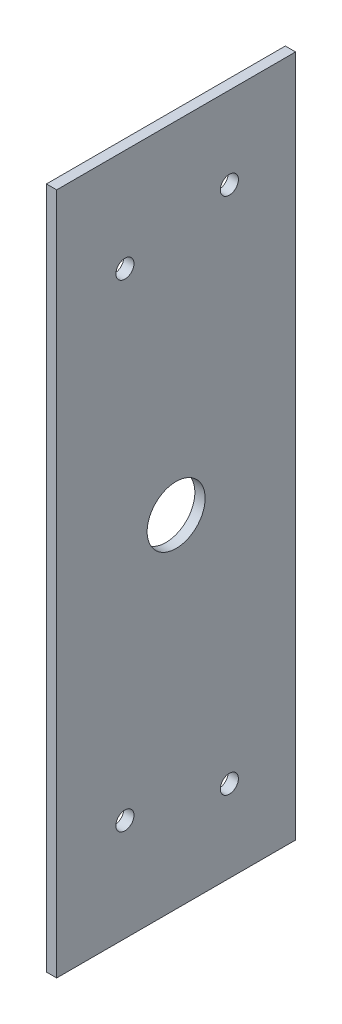
ISO-10303-21;
HEADER;
FILE_DESCRIPTION(('STEP AP214'),'2;1');
FILE_NAME('part.step','',(''),(''),'','','');
FILE_SCHEMA(('AUTOMOTIVE_DESIGN { 1 0 10303 214 1 1 1 1 }'));
ENDSEC;
DATA;
#1=APPLICATION_CONTEXT('core data for automotive mechanical design processes');
#2=APPLICATION_PROTOCOL_DEFINITION('international standard','automotive_design',2000,#1);
#3=PRODUCT_CONTEXT('',#1,'mechanical');
#4=PRODUCT('Part','Part','',(#3));
#5=PRODUCT_RELATED_PRODUCT_CATEGORY('part','',(#4));
#6=PRODUCT_DEFINITION_FORMATION('','',#4);
#7=PRODUCT_DEFINITION_CONTEXT('part definition',#1,'design');
#8=PRODUCT_DEFINITION('design','',#6,#7);
#9=PRODUCT_DEFINITION_SHAPE('','',#8);
#10=(LENGTH_UNIT() NAMED_UNIT(*) SI_UNIT(.MILLI.,.METRE.));
#11=(NAMED_UNIT(*) PLANE_ANGLE_UNIT() SI_UNIT($,.RADIAN.));
#12=(NAMED_UNIT(*) SI_UNIT($,.STERADIAN.) SOLID_ANGLE_UNIT());
#13=UNCERTAINTY_MEASURE_WITH_UNIT(LENGTH_MEASURE(1.E-05),#10,'distance_accuracy_value','');
#14=(GEOMETRIC_REPRESENTATION_CONTEXT(3) GLOBAL_UNCERTAINTY_ASSIGNED_CONTEXT((#13)) GLOBAL_UNIT_ASSIGNED_CONTEXT((#10,
#11,#12)) REPRESENTATION_CONTEXT('',''));
#15=CARTESIAN_POINT('',(0.,0.,0.));
#16=DIRECTION('',(0.,0.,1.));
#17=DIRECTION('',(1.,0.,0.));
#18=AXIS2_PLACEMENT_3D('',#15,#16,#17);
#19=CARTESIAN_POINT('',(3.,0.,0.));
#20=DIRECTION('',(1.,0.,0.));
#21=DIRECTION('',(0.,0.,-1.));
#22=AXIS2_PLACEMENT_3D('',#19,#20,#21);
#23=PLANE('',#22);
#24=CARTESIAN_POINT('',(3.,-70.,15.));
#25=DIRECTION('',(1.,0.,0.));
#26=DIRECTION('',(0.,0.,-1.));
#27=AXIS2_PLACEMENT_3D('',#24,#25,#26);
#28=CIRCLE('',#27,2.65);
#29=CARTESIAN_POINT('',(3.,-70.,12.35));
#30=VERTEX_POINT('',#29);
#31=EDGE_CURVE('E140',#30,#30,#28,.T.);
#32=ORIENTED_EDGE('',*,*,#31,.F.);
#33=EDGE_LOOP('',(#32));
#34=FACE_BOUND('',#33,.T.);
#35=CARTESIAN_POINT('',(3.,-76.,-15.6));
#36=DIRECTION('',(1.,0.,0.));
#37=DIRECTION('',(0.,0.,-1.));
#38=AXIS2_PLACEMENT_3D('',#35,#36,#37);
#39=CIRCLE('',#38,2.65);
#40=CARTESIAN_POINT('',(3.,-76.,-18.25));
#41=VERTEX_POINT('',#40);
#42=EDGE_CURVE('E124',#41,#41,#39,.T.);
#43=ORIENTED_EDGE('',*,*,#42,.F.);
#44=EDGE_LOOP('',(#43));
#45=FACE_BOUND('',#44,.T.);
#46=DIRECTION('',(0.,0.,-1.));
#47=VECTOR('',#46,1.);
#48=CARTESIAN_POINT('',(3.,-100.,35.));
#49=LINE('',#48,#47);
#50=CARTESIAN_POINT('',(3.,-100.,35.));
#51=VERTEX_POINT('',#50);
#52=CARTESIAN_POINT('',(3.,-100.,-35.));
#53=VERTEX_POINT('',#52);
#54=EDGE_CURVE('E92',#51,#53,#49,.T.);
#55=ORIENTED_EDGE('',*,*,#54,.T.);
#56=DIRECTION('',(0.,1.,0.));
#57=VECTOR('',#56,1.);
#58=CARTESIAN_POINT('',(3.,-100.,-35.));
#59=LINE('',#58,#57);
#60=CARTESIAN_POINT('',(3.,100.,-35.));
#61=VERTEX_POINT('',#60);
#62=EDGE_CURVE('E89',#53,#61,#59,.T.);
#63=ORIENTED_EDGE('',*,*,#62,.T.);
#64=DIRECTION('',(0.,0.,1.));
#65=VECTOR('',#64,1.);
#66=CARTESIAN_POINT('',(3.,100.,35.));
#67=LINE('',#66,#65);
#68=CARTESIAN_POINT('',(3.,100.,35.));
#69=VERTEX_POINT('',#68);
#70=EDGE_CURVE('E91',#61,#69,#67,.T.);
#71=ORIENTED_EDGE('',*,*,#70,.T.);
#72=DIRECTION('',(0.,-1.,0.));
#73=VECTOR('',#72,1.);
#74=CARTESIAN_POINT('',(3.,-100.,35.));
#75=LINE('',#74,#73);
#76=EDGE_CURVE('E58',#69,#51,#75,.T.);
#77=ORIENTED_EDGE('',*,*,#76,.T.);
#78=EDGE_LOOP('',(#55,#63,#71,#77));
#79=FACE_BOUND('',#78,.T.);
#80=CARTESIAN_POINT('',(3.,0.,0.));
#81=DIRECTION('',(1.,0.,0.));
#82=DIRECTION('',(0.,0.,-1.));
#83=AXIS2_PLACEMENT_3D('',#80,#81,#82);
#84=CIRCLE('',#83,8.5);
#85=CARTESIAN_POINT('',(3.,0.,-8.5));
#86=VERTEX_POINT('',#85);
#87=EDGE_CURVE('E109',#86,#86,#84,.T.);
#88=ORIENTED_EDGE('',*,*,#87,.F.);
#89=EDGE_LOOP('',(#88));
#90=FACE_BOUND('',#89,.T.);
#91=CARTESIAN_POINT('',(3.,76.,-15.5999999999999));
#92=DIRECTION('',(1.,0.,0.));
#93=DIRECTION('',(0.,0.,1.));
#94=AXIS2_PLACEMENT_3D('',#91,#92,#93);
#95=CIRCLE('',#94,2.65);
#96=CARTESIAN_POINT('',(3.,76.,-12.9499999999999));
#97=VERTEX_POINT('',#96);
#98=EDGE_CURVE('E132',#97,#97,#95,.T.);
#99=ORIENTED_EDGE('',*,*,#98,.F.);
#100=EDGE_LOOP('',(#99));
#101=FACE_BOUND('',#100,.T.);
#102=CARTESIAN_POINT('',(3.,70.,15.));
#103=DIRECTION('',(1.,0.,0.));
#104=DIRECTION('',(0.,0.,1.));
#105=AXIS2_PLACEMENT_3D('',#102,#103,#104);
#106=CIRCLE('',#105,2.65);
#107=CARTESIAN_POINT('',(3.,70.,17.65));
#108=VERTEX_POINT('',#107);
#109=EDGE_CURVE('E141',#108,#108,#106,.T.);
#110=ORIENTED_EDGE('',*,*,#109,.F.);
#111=EDGE_LOOP('',(#110));
#112=FACE_BOUND('',#111,.T.);
#113=ADVANCED_FACE('F43',(#34,#45,#79,#90,#101,#112),#23,.T.);
#114=CARTESIAN_POINT('',(0.,0.,0.));
#115=DIRECTION('',(1.,0.,0.));
#116=DIRECTION('',(0.,0.,-1.));
#117=AXIS2_PLACEMENT_3D('',#114,#115,#116);
#118=PLANE('',#117);
#119=DIRECTION('',(0.,0.,-1.));
#120=VECTOR('',#119,1.);
#121=CARTESIAN_POINT('',(0.,-100.,35.));
#122=LINE('',#121,#120);
#123=CARTESIAN_POINT('',(0.,-100.,35.));
#124=VERTEX_POINT('',#123);
#125=CARTESIAN_POINT('',(0.,-100.,-35.));
#126=VERTEX_POINT('',#125);
#127=EDGE_CURVE('E110',#124,#126,#122,.T.);
#128=ORIENTED_EDGE('',*,*,#127,.F.);
#129=DIRECTION('',(0.,-1.,0.));
#130=VECTOR('',#129,1.);
#131=CARTESIAN_POINT('',(0.,-100.,35.));
#132=LINE('',#131,#130);
#133=CARTESIAN_POINT('',(0.,100.,35.));
#134=VERTEX_POINT('',#133);
#135=EDGE_CURVE('E82',#134,#124,#132,.T.);
#136=ORIENTED_EDGE('',*,*,#135,.F.);
#137=DIRECTION('',(0.,0.,1.));
#138=VECTOR('',#137,1.);
#139=CARTESIAN_POINT('',(0.,100.,35.));
#140=LINE('',#139,#138);
#141=CARTESIAN_POINT('',(0.,100.,-35.));
#142=VERTEX_POINT('',#141);
#143=EDGE_CURVE('E80',#142,#134,#140,.T.);
#144=ORIENTED_EDGE('',*,*,#143,.F.);
#145=DIRECTION('',(0.,1.,0.));
#146=VECTOR('',#145,1.);
#147=CARTESIAN_POINT('',(0.,-100.,-35.));
#148=LINE('',#147,#146);
#149=EDGE_CURVE('E97',#126,#142,#148,.T.);
#150=ORIENTED_EDGE('',*,*,#149,.F.);
#151=EDGE_LOOP('',(#128,#136,#144,#150));
#152=FACE_BOUND('',#151,.T.);
#153=CARTESIAN_POINT('',(0.,0.,0.));
#154=DIRECTION('',(1.,0.,0.));
#155=DIRECTION('',(0.,0.,-1.));
#156=AXIS2_PLACEMENT_3D('',#153,#154,#155);
#157=CIRCLE('',#156,8.5);
#158=CARTESIAN_POINT('',(0.,0.,-8.5));
#159=VERTEX_POINT('',#158);
#160=EDGE_CURVE('E125',#159,#159,#157,.T.);
#161=ORIENTED_EDGE('',*,*,#160,.T.);
#162=EDGE_LOOP('',(#161));
#163=FACE_BOUND('',#162,.T.);
#164=CARTESIAN_POINT('',(0.,-76.,-15.6));
#165=DIRECTION('',(1.,0.,0.));
#166=DIRECTION('',(0.,0.,-1.));
#167=AXIS2_PLACEMENT_3D('',#164,#165,#166);
#168=CIRCLE('',#167,2.65);
#169=CARTESIAN_POINT('',(0.,-76.,-18.25));
#170=VERTEX_POINT('',#169);
#171=EDGE_CURVE('E126',#170,#170,#168,.T.);
#172=ORIENTED_EDGE('',*,*,#171,.T.);
#173=EDGE_LOOP('',(#172));
#174=FACE_BOUND('',#173,.T.);
#175=CARTESIAN_POINT('',(0.,76.,-15.5999999999999));
#176=DIRECTION('',(1.,0.,0.));
#177=DIRECTION('',(0.,0.,1.));
#178=AXIS2_PLACEMENT_3D('',#175,#176,#177);
#179=CIRCLE('',#178,2.65);
#180=CARTESIAN_POINT('',(0.,76.,-12.9499999999999));
#181=VERTEX_POINT('',#180);
#182=EDGE_CURVE('E131',#181,#181,#179,.T.);
#183=ORIENTED_EDGE('',*,*,#182,.T.);
#184=EDGE_LOOP('',(#183));
#185=FACE_BOUND('',#184,.T.);
#186=CARTESIAN_POINT('',(0.,-70.,15.));
#187=DIRECTION('',(1.,0.,0.));
#188=DIRECTION('',(0.,0.,-1.));
#189=AXIS2_PLACEMENT_3D('',#186,#187,#188);
#190=CIRCLE('',#189,2.65);
#191=CARTESIAN_POINT('',(0.,-70.,12.35));
#192=VERTEX_POINT('',#191);
#193=EDGE_CURVE('E139',#192,#192,#190,.T.);
#194=ORIENTED_EDGE('',*,*,#193,.T.);
#195=EDGE_LOOP('',(#194));
#196=FACE_BOUND('',#195,.T.);
#197=CARTESIAN_POINT('',(0.,70.,15.));
#198=DIRECTION('',(1.,0.,0.));
#199=DIRECTION('',(0.,0.,1.));
#200=AXIS2_PLACEMENT_3D('',#197,#198,#199);
#201=CIRCLE('',#200,2.65);
#202=CARTESIAN_POINT('',(0.,70.,17.65));
#203=VERTEX_POINT('',#202);
#204=EDGE_CURVE('E148',#203,#203,#201,.T.);
#205=ORIENTED_EDGE('',*,*,#204,.T.);
#206=EDGE_LOOP('',(#205));
#207=FACE_BOUND('',#206,.T.);
#208=ADVANCED_FACE('F119',(#152,#163,#174,#185,#196,#207),#118,.F.);
#209=CARTESIAN_POINT('',(3.,-100.,35.));
#210=DIRECTION('',(0.,1.,0.));
#211=DIRECTION('',(0.,0.,1.));
#212=AXIS2_PLACEMENT_3D('',#209,#210,#211);
#213=PLANE('',#212);
#214=ORIENTED_EDGE('',*,*,#127,.T.);
#215=DIRECTION('',(-1.,0.,0.));
#216=VECTOR('',#215,1.);
#217=CARTESIAN_POINT('',(3.,-100.,-35.));
#218=LINE('',#217,#216);
#219=EDGE_CURVE('E11',#53,#126,#218,.T.);
#220=ORIENTED_EDGE('',*,*,#219,.F.);
#221=ORIENTED_EDGE('',*,*,#54,.F.);
#222=DIRECTION('',(-1.,0.,0.));
#223=VECTOR('',#222,1.);
#224=CARTESIAN_POINT('',(3.,-100.,35.));
#225=LINE('',#224,#223);
#226=EDGE_CURVE('E103',#51,#124,#225,.T.);
#227=ORIENTED_EDGE('',*,*,#226,.T.);
#228=EDGE_LOOP('',(#214,#220,#221,#227));
#229=FACE_BOUND('',#228,.T.);
#230=ADVANCED_FACE('F44',(#229),#213,.F.);
#231=CARTESIAN_POINT('',(3.,-100.,-35.));
#232=DIRECTION('',(0.,0.,1.));
#233=DIRECTION('',(1.,0.,0.));
#234=AXIS2_PLACEMENT_3D('',#231,#232,#233);
#235=PLANE('',#234);
#236=ORIENTED_EDGE('',*,*,#149,.T.);
#237=DIRECTION('',(-1.,0.,0.));
#238=VECTOR('',#237,1.);
#239=CARTESIAN_POINT('',(3.,100.,-35.));
#240=LINE('',#239,#238);
#241=EDGE_CURVE('E55',#61,#142,#240,.T.);
#242=ORIENTED_EDGE('',*,*,#241,.F.);
#243=ORIENTED_EDGE('',*,*,#62,.F.);
#244=ORIENTED_EDGE('',*,*,#219,.T.);
#245=EDGE_LOOP('',(#236,#242,#243,#244));
#246=FACE_BOUND('',#245,.T.);
#247=ADVANCED_FACE('F98',(#246),#235,.F.);
#248=CARTESIAN_POINT('',(3.,100.,35.));
#249=DIRECTION('',(0.,-1.,0.));
#250=DIRECTION('',(0.,0.,-1.));
#251=AXIS2_PLACEMENT_3D('',#248,#249,#250);
#252=PLANE('',#251);
#253=ORIENTED_EDGE('',*,*,#143,.T.);
#254=DIRECTION('',(-1.,0.,0.));
#255=VECTOR('',#254,1.);
#256=CARTESIAN_POINT('',(3.,100.,35.));
#257=LINE('',#256,#255);
#258=EDGE_CURVE('E99',#69,#134,#257,.T.);
#259=ORIENTED_EDGE('',*,*,#258,.F.);
#260=ORIENTED_EDGE('',*,*,#70,.F.);
#261=ORIENTED_EDGE('',*,*,#241,.T.);
#262=EDGE_LOOP('',(#253,#259,#260,#261));
#263=FACE_BOUND('',#262,.T.);
#264=ADVANCED_FACE('F101',(#263),#252,.F.);
#265=CARTESIAN_POINT('',(3.,-100.,35.));
#266=DIRECTION('',(0.,0.,-1.));
#267=DIRECTION('',(-1.,0.,0.));
#268=AXIS2_PLACEMENT_3D('',#265,#266,#267);
#269=PLANE('',#268);
#270=ORIENTED_EDGE('',*,*,#135,.T.);
#271=ORIENTED_EDGE('',*,*,#226,.F.);
#272=ORIENTED_EDGE('',*,*,#76,.F.);
#273=ORIENTED_EDGE('',*,*,#258,.T.);
#274=EDGE_LOOP('',(#270,#271,#272,#273));
#275=FACE_BOUND('',#274,.T.);
#276=ADVANCED_FACE('F113',(#275),#269,.F.);
#277=CARTESIAN_POINT('',(3.,0.,0.));
#278=DIRECTION('',(-1.,0.,0.));
#279=DIRECTION('',(0.,0.,1.));
#280=AXIS2_PLACEMENT_3D('',#277,#278,#279);
#281=CYLINDRICAL_SURFACE('',#280,8.5);
#282=ORIENTED_EDGE('',*,*,#87,.T.);
#283=EDGE_LOOP('',(#282));
#284=FACE_BOUND('',#283,.T.);
#285=ORIENTED_EDGE('',*,*,#160,.F.);
#286=EDGE_LOOP('',(#285));
#287=FACE_BOUND('',#286,.T.);
#288=ADVANCED_FACE('F164',(#284,#287),#281,.F.);
#289=CARTESIAN_POINT('',(3.,-76.,-15.6));
#290=DIRECTION('',(-1.,0.,0.));
#291=DIRECTION('',(0.,0.,1.));
#292=AXIS2_PLACEMENT_3D('',#289,#290,#291);
#293=CYLINDRICAL_SURFACE('',#292,2.65);
#294=ORIENTED_EDGE('',*,*,#42,.T.);
#295=EDGE_LOOP('',(#294));
#296=FACE_BOUND('',#295,.T.);
#297=ORIENTED_EDGE('',*,*,#171,.F.);
#298=EDGE_LOOP('',(#297));
#299=FACE_BOUND('',#298,.T.);
#300=ADVANCED_FACE('F209',(#296,#299),#293,.F.);
#301=CARTESIAN_POINT('',(3.,76.,-15.5999999999999));
#302=DIRECTION('',(-1.,0.,0.));
#303=DIRECTION('',(0.,0.,1.));
#304=AXIS2_PLACEMENT_3D('',#301,#302,#303);
#305=CYLINDRICAL_SURFACE('',#304,2.65);
#306=ORIENTED_EDGE('',*,*,#98,.T.);
#307=EDGE_LOOP('',(#306));
#308=FACE_BOUND('',#307,.T.);
#309=ORIENTED_EDGE('',*,*,#182,.F.);
#310=EDGE_LOOP('',(#309));
#311=FACE_BOUND('',#310,.T.);
#312=ADVANCED_FACE('F217',(#308,#311),#305,.F.);
#313=CARTESIAN_POINT('',(3.,-70.,15.));
#314=DIRECTION('',(-1.,0.,0.));
#315=DIRECTION('',(0.,0.,1.));
#316=AXIS2_PLACEMENT_3D('',#313,#314,#315);
#317=CYLINDRICAL_SURFACE('',#316,2.65);
#318=ORIENTED_EDGE('',*,*,#31,.T.);
#319=EDGE_LOOP('',(#318));
#320=FACE_BOUND('',#319,.T.);
#321=ORIENTED_EDGE('',*,*,#193,.F.);
#322=EDGE_LOOP('',(#321));
#323=FACE_BOUND('',#322,.T.);
#324=ADVANCED_FACE('F227',(#320,#323),#317,.F.);
#325=CARTESIAN_POINT('',(3.,70.,15.));
#326=DIRECTION('',(-1.,0.,0.));
#327=DIRECTION('',(0.,0.,1.));
#328=AXIS2_PLACEMENT_3D('',#325,#326,#327);
#329=CYLINDRICAL_SURFACE('',#328,2.65);
#330=ORIENTED_EDGE('',*,*,#109,.T.);
#331=EDGE_LOOP('',(#330));
#332=FACE_BOUND('',#331,.T.);
#333=ORIENTED_EDGE('',*,*,#204,.F.);
#334=EDGE_LOOP('',(#333));
#335=FACE_BOUND('',#334,.T.);
#336=ADVANCED_FACE('F155',(#332,#335),#329,.F.);
#337=CLOSED_SHELL('',(#113,#208,#230,#247,#264,#276,#288,#300,#312,#324,#336));
#338=MANIFOLD_SOLID_BREP('B2',#337);
#339=ADVANCED_BREP_SHAPE_REPRESENTATION('',(#18,#338),#14);
#340=SHAPE_DEFINITION_REPRESENTATION(#9,#339);
ENDSEC;
END-ISO-10303-21;
